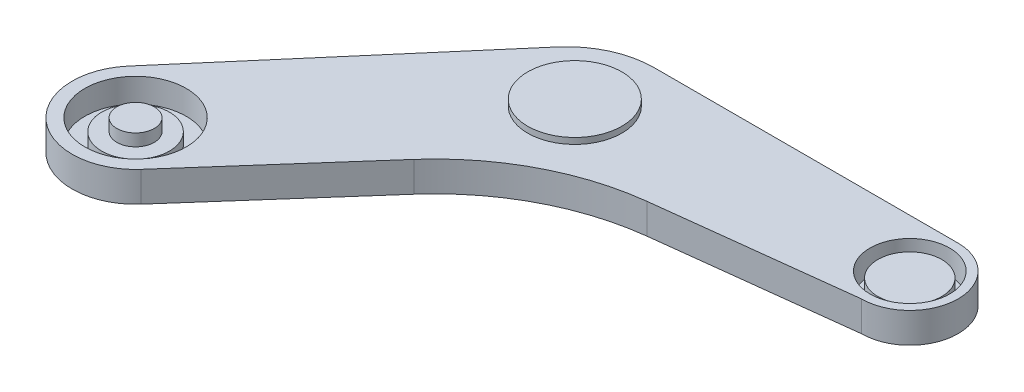
ISO-10303-21;
HEADER;
FILE_DESCRIPTION(('STEP AP214'),'2;1');
FILE_NAME('part.step','',(''),(''),'','','');
FILE_SCHEMA(('AUTOMOTIVE_DESIGN { 1 0 10303 214 1 1 1 1 }'));
ENDSEC;
DATA;
#1=APPLICATION_CONTEXT('core data for automotive mechanical design processes');
#2=APPLICATION_PROTOCOL_DEFINITION('international standard','automotive_design',2000,#1);
#3=PRODUCT_CONTEXT('',#1,'mechanical');
#4=PRODUCT('Part','Part','',(#3));
#5=PRODUCT_RELATED_PRODUCT_CATEGORY('part','',(#4));
#6=PRODUCT_DEFINITION_FORMATION('','',#4);
#7=PRODUCT_DEFINITION_CONTEXT('part definition',#1,'design');
#8=PRODUCT_DEFINITION('design','',#6,#7);
#9=PRODUCT_DEFINITION_SHAPE('','',#8);
#10=(LENGTH_UNIT() NAMED_UNIT(*) SI_UNIT(.MILLI.,.METRE.));
#11=(NAMED_UNIT(*) PLANE_ANGLE_UNIT() SI_UNIT($,.RADIAN.));
#12=(NAMED_UNIT(*) SI_UNIT($,.STERADIAN.) SOLID_ANGLE_UNIT());
#13=UNCERTAINTY_MEASURE_WITH_UNIT(LENGTH_MEASURE(1.E-05),#10,'distance_accuracy_value','');
#14=(GEOMETRIC_REPRESENTATION_CONTEXT(3) GLOBAL_UNCERTAINTY_ASSIGNED_CONTEXT((#13)) GLOBAL_UNIT_ASSIGNED_CONTEXT((#10,
#11,#12)) REPRESENTATION_CONTEXT('',''));
#15=CARTESIAN_POINT('',(0.,0.,0.));
#16=DIRECTION('',(0.,0.,1.));
#17=DIRECTION('',(1.,0.,0.));
#18=AXIS2_PLACEMENT_3D('',#15,#16,#17);
#19=CARTESIAN_POINT('',(243.447275793049,50.,474.15822190538));
#20=DIRECTION('',(0.,-1.,0.));
#21=DIRECTION('',(0.,0.,-1.));
#22=AXIS2_PLACEMENT_3D('',#19,#20,#21);
#23=CYLINDRICAL_SURFACE('',#22,400.);
#24=CARTESIAN_POINT('',(243.447275793049,0.,474.15822190538));
#25=DIRECTION('',(0.,1.,0.));
#26=DIRECTION('',(0.,0.,1.));
#27=AXIS2_PLACEMENT_3D('',#24,#25,#26);
#28=CIRCLE('',#27,400.);
#29=CARTESIAN_POINT('',(196.291302455074,0.,76.9475546536709));
#30=VERTEX_POINT('',#29);
#31=CARTESIAN_POINT('',(-56.6839412683943,0.,209.731951377626));
#32=VERTEX_POINT('',#31);
#33=EDGE_CURVE('E133',#30,#32,#28,.T.);
#34=ORIENTED_EDGE('',*,*,#33,.F.);
#35=DIRECTION('',(0.,-1.,0.));
#36=VECTOR('',#35,1.);
#37=CARTESIAN_POINT('',(196.291302455074,50.,76.9475546536709));
#38=LINE('',#37,#36);
#39=CARTESIAN_POINT('',(196.291302455074,50.,76.9475546536709));
#40=VERTEX_POINT('',#39);
#41=EDGE_CURVE('E39',#40,#30,#38,.T.);
#42=ORIENTED_EDGE('',*,*,#41,.F.);
#43=CARTESIAN_POINT('',(243.447275793049,50.,474.15822190538));
#44=DIRECTION('',(0.,1.,0.));
#45=DIRECTION('',(0.,0.,1.));
#46=AXIS2_PLACEMENT_3D('',#43,#44,#45);
#47=CIRCLE('',#46,400.);
#48=CARTESIAN_POINT('',(-56.6839412683943,50.,209.731951377626));
#49=VERTEX_POINT('',#48);
#50=EDGE_CURVE('E153',#40,#49,#47,.T.);
#51=ORIENTED_EDGE('',*,*,#50,.T.);
#52=DIRECTION('',(0.,-1.,0.));
#53=VECTOR('',#52,1.);
#54=CARTESIAN_POINT('',(-56.6839412683943,50.,209.731951377626));
#55=LINE('',#54,#53);
#56=EDGE_CURVE('E89',#49,#32,#55,.T.);
#57=ORIENTED_EDGE('',*,*,#56,.T.);
#58=EDGE_LOOP('',(#34,#42,#51,#57));
#59=FACE_BOUND('',#58,.T.);
#60=ADVANCED_FACE('F36',(#59),#23,.F.);
#61=CARTESIAN_POINT('',(11.7361482736743,50.,98.8575350431175));
#62=DIRECTION('',(0.117889933344937,0.,0.993026668129273));
#63=DIRECTION('',(0.993026668129274,0.,-0.117889933344937));
#64=AXIS2_PLACEMENT_3D('',#61,#62,#63);
#65=PLANE('',#64);
#66=DIRECTION('',(-0.993026668129274,0.,0.117889933344937));
#67=VECTOR('',#66,1.);
#68=CARTESIAN_POINT('',(11.7361482736743,0.,98.8575350431175));
#69=LINE('',#68,#67);
#70=CARTESIAN_POINT('',(514.059836256441,0.,39.222775983291));
#71=VERTEX_POINT('',#70);
#72=EDGE_CURVE('E136',#71,#30,#69,.T.);
#73=ORIENTED_EDGE('',*,*,#72,.F.);
#74=DIRECTION('',(0.,-1.,0.));
#75=VECTOR('',#74,1.);
#76=CARTESIAN_POINT('',(514.059836256441,50.,39.222775983291));
#77=LINE('',#76,#75);
#78=CARTESIAN_POINT('',(514.059836256441,50.,39.222775983291));
#79=VERTEX_POINT('',#78);
#80=EDGE_CURVE('E160',#79,#71,#77,.T.);
#81=ORIENTED_EDGE('',*,*,#80,.F.);
#82=DIRECTION('',(-0.993026668129274,0.,0.117889933344937));
#83=VECTOR('',#82,1.);
#84=CARTESIAN_POINT('',(11.7361482736743,50.,98.8575350431175));
#85=LINE('',#84,#83);
#86=EDGE_CURVE('E193',#79,#40,#85,.T.);
#87=ORIENTED_EDGE('',*,*,#86,.T.);
#88=ORIENTED_EDGE('',*,*,#41,.T.);
#89=EDGE_LOOP('',(#73,#81,#87,#88));
#90=FACE_BOUND('',#89,.T.);
#91=ADVANCED_FACE('F210',(#90),#65,.T.);
#92=CARTESIAN_POINT('',(514.059836256441,50.,-40.777224016709));
#93=DIRECTION('',(0.,-1.,0.));
#94=DIRECTION('',(0.,0.,-1.));
#95=AXIS2_PLACEMENT_3D('',#92,#93,#94);
#96=CYLINDRICAL_SURFACE('',#95,80.);
#97=CARTESIAN_POINT('',(514.059836256441,0.,-40.777224016709));
#98=DIRECTION('',(0.,1.,0.));
#99=DIRECTION('',(0.,0.,1.));
#100=AXIS2_PLACEMENT_3D('',#97,#98,#99);
#101=CIRCLE('',#100,80.);
#102=CARTESIAN_POINT('',(514.059836256441,0.,-120.777224016709));
#103=VERTEX_POINT('',#102);
#104=EDGE_CURVE('E140',#71,#103,#101,.T.);
#105=ORIENTED_EDGE('',*,*,#104,.T.);
#106=DIRECTION('',(0.,-1.,0.));
#107=VECTOR('',#106,1.);
#108=CARTESIAN_POINT('',(514.059836256441,50.,-120.777224016709));
#109=LINE('',#108,#107);
#110=CARTESIAN_POINT('',(514.059836256441,50.,-120.777224016709));
#111=VERTEX_POINT('',#110);
#112=EDGE_CURVE('E159',#111,#103,#109,.T.);
#113=ORIENTED_EDGE('',*,*,#112,.F.);
#114=CARTESIAN_POINT('',(514.059836256441,50.,-40.777224016709));
#115=DIRECTION('',(0.,1.,0.));
#116=DIRECTION('',(0.,0.,1.));
#117=AXIS2_PLACEMENT_3D('',#114,#115,#116);
#118=CIRCLE('',#117,80.);
#119=EDGE_CURVE('E195',#79,#111,#118,.T.);
#120=ORIENTED_EDGE('',*,*,#119,.F.);
#121=ORIENTED_EDGE('',*,*,#80,.T.);
#122=EDGE_LOOP('',(#105,#113,#120,#121));
#123=FACE_BOUND('',#122,.T.);
#124=ADVANCED_FACE('F211',(#123),#96,.T.);
#125=CARTESIAN_POINT('',(0.,50.,-120.777224016709));
#126=DIRECTION('',(0.,0.,-1.));
#127=DIRECTION('',(-1.,0.,0.));
#128=AXIS2_PLACEMENT_3D('',#125,#126,#127);
#129=PLANE('',#128);
#130=DIRECTION('',(1.,0.,0.));
#131=VECTOR('',#130,1.);
#132=CARTESIAN_POINT('',(0.,0.,-120.777224016709));
#133=LINE('',#132,#131);
#134=CARTESIAN_POINT('',(10.7784276607523,0.,-120.777224016709));
#135=VERTEX_POINT('',#134);
#136=EDGE_CURVE('E143',#135,#103,#133,.T.);
#137=ORIENTED_EDGE('',*,*,#136,.F.);
#138=DIRECTION('',(0.,-1.,0.));
#139=VECTOR('',#138,1.);
#140=CARTESIAN_POINT('',(10.7784276607523,50.,-120.777224016709));
#141=LINE('',#140,#139);
#142=CARTESIAN_POINT('',(10.7784276607523,50.,-120.777224016709));
#143=VERTEX_POINT('',#142);
#144=EDGE_CURVE('E157',#143,#135,#141,.T.);
#145=ORIENTED_EDGE('',*,*,#144,.F.);
#146=DIRECTION('',(1.,0.,0.));
#147=VECTOR('',#146,1.);
#148=CARTESIAN_POINT('',(0.,50.,-120.777224016709));
#149=LINE('',#148,#147);
#150=EDGE_CURVE('E128',#143,#111,#149,.T.);
#151=ORIENTED_EDGE('',*,*,#150,.T.);
#152=ORIENTED_EDGE('',*,*,#112,.T.);
#153=EDGE_LOOP('',(#137,#145,#151,#152));
#154=FACE_BOUND('',#153,.T.);
#155=ADVANCED_FACE('F199',(#154),#129,.T.);
#156=CARTESIAN_POINT('',(10.7784276607523,50.,24.2227759832912));
#157=DIRECTION('',(0.,-1.,0.));
#158=DIRECTION('',(0.,0.,-1.));
#159=AXIS2_PLACEMENT_3D('',#156,#157,#158);
#160=CYLINDRICAL_SURFACE('',#159,145.);
#161=CARTESIAN_POINT('',(10.7784276607523,0.,24.2227759832912));
#162=DIRECTION('',(0.,1.,0.));
#163=DIRECTION('',(0.,0.,1.));
#164=AXIS2_PLACEMENT_3D('',#161,#162,#163);
#165=CIRCLE('',#164,145.);
#166=CARTESIAN_POINT('',(-99.3438825510357,0.,-70.1068418131291));
#167=VERTEX_POINT('',#166);
#168=EDGE_CURVE('E146',#167,#135,#165,.F.);
#169=ORIENTED_EDGE('',*,*,#168,.F.);
#170=DIRECTION('',(0.,-1.,0.));
#171=VECTOR('',#170,1.);
#172=CARTESIAN_POINT('',(-99.3438825510357,50.,-70.1068418131291));
#173=LINE('',#172,#171);
#174=CARTESIAN_POINT('',(-99.3438825510357,50.,-70.1068418131291));
#175=VERTEX_POINT('',#174);
#176=EDGE_CURVE('E116',#175,#167,#173,.T.);
#177=ORIENTED_EDGE('',*,*,#176,.F.);
#178=CARTESIAN_POINT('',(10.7784276607523,50.,24.2227759832912));
#179=DIRECTION('',(0.,1.,0.));
#180=DIRECTION('',(0.,0.,1.));
#181=AXIS2_PLACEMENT_3D('',#178,#179,#180);
#182=CIRCLE('',#181,145.);
#183=EDGE_CURVE('E126',#175,#143,#182,.F.);
#184=ORIENTED_EDGE('',*,*,#183,.T.);
#185=ORIENTED_EDGE('',*,*,#144,.T.);
#186=EDGE_LOOP('',(#169,#177,#184,#185));
#187=FACE_BOUND('',#186,.T.);
#188=ADVANCED_FACE('F204',(#187),#160,.T.);
#189=CARTESIAN_POINT('',(-91.937748677205,50.,-78.752912803093));
#190=DIRECTION('',(-0.759464208357158,0.,-0.650549088251175));
#191=DIRECTION('',(-0.650549088251175,0.,0.759464208357158));
#192=AXIS2_PLACEMENT_3D('',#189,#190,#191);
#193=PLANE('',#192);
#194=DIRECTION('',(0.650549088251175,0.,-0.759464208357159));
#195=VECTOR('',#194,1.);
#196=CARTESIAN_POINT('',(-91.937748677205,0.,-78.752912803093));
#197=LINE('',#196,#195);
#198=CARTESIAN_POINT('',(-426.753144046728,0.,312.117374746871));
#199=VERTEX_POINT('',#198);
#200=EDGE_CURVE('E115',#199,#167,#197,.T.);
#201=ORIENTED_EDGE('',*,*,#200,.F.);
#202=DIRECTION('',(0.,-1.,0.));
#203=VECTOR('',#202,1.);
#204=CARTESIAN_POINT('',(-426.753144046728,50.,312.117374746871));
#205=LINE('',#204,#203);
#206=CARTESIAN_POINT('',(-426.753144046728,50.,312.117374746871));
#207=VERTEX_POINT('',#206);
#208=EDGE_CURVE('E109',#207,#199,#205,.T.);
#209=ORIENTED_EDGE('',*,*,#208,.F.);
#210=DIRECTION('',(0.650549088251175,0.,-0.759464208357159));
#211=VECTOR('',#210,1.);
#212=CARTESIAN_POINT('',(-91.937748677205,50.,-78.752912803093));
#213=LINE('',#212,#211);
#214=EDGE_CURVE('E113',#207,#175,#213,.T.);
#215=ORIENTED_EDGE('',*,*,#214,.T.);
#216=ORIENTED_EDGE('',*,*,#176,.T.);
#217=EDGE_LOOP('',(#201,#209,#215,#216));
#218=FACE_BOUND('',#217,.T.);
#219=ADVANCED_FACE('F111',(#218),#193,.T.);
#220=CARTESIAN_POINT('',(-347.009402169226,50.,380.425029013245));
#221=DIRECTION('',(0.,-1.,0.));
#222=DIRECTION('',(0.,0.,-1.));
#223=AXIS2_PLACEMENT_3D('',#220,#221,#222);
#224=CYLINDRICAL_SURFACE('',#223,105.);
#225=CARTESIAN_POINT('',(-347.009402169226,0.,380.425029013245));
#226=DIRECTION('',(0.,1.,0.));
#227=DIRECTION('',(0.,0.,1.));
#228=AXIS2_PLACEMENT_3D('',#225,#226,#227);
#229=CIRCLE('',#228,105.);
#230=CARTESIAN_POINT('',(-268.224957690598,0.,449.83692502678));
#231=VERTEX_POINT('',#230);
#232=EDGE_CURVE('E82',#199,#231,#229,.T.);
#233=ORIENTED_EDGE('',*,*,#232,.T.);
#234=DIRECTION('',(0.,-1.,0.));
#235=VECTOR('',#234,1.);
#236=CARTESIAN_POINT('',(-268.224957690598,50.,449.83692502678));
#237=LINE('',#236,#235);
#238=CARTESIAN_POINT('',(-268.224957690598,50.,449.83692502678));
#239=VERTEX_POINT('',#238);
#240=EDGE_CURVE('E117',#239,#231,#237,.T.);
#241=ORIENTED_EDGE('',*,*,#240,.F.);
#242=CARTESIAN_POINT('',(-347.009402169226,50.,380.425029013245));
#243=DIRECTION('',(0.,1.,0.));
#244=DIRECTION('',(0.,0.,1.));
#245=AXIS2_PLACEMENT_3D('',#242,#243,#244);
#246=CIRCLE('',#245,105.);
#247=EDGE_CURVE('E119',#207,#239,#246,.T.);
#248=ORIENTED_EDGE('',*,*,#247,.F.);
#249=ORIENTED_EDGE('',*,*,#208,.T.);
#250=EDGE_LOOP('',(#233,#241,#248,#249));
#251=FACE_BOUND('',#250,.T.);
#252=ADVANCED_FACE('F120',(#251),#224,.T.);
#253=CARTESIAN_POINT('',(72.1178125200194,50.,63.5383562896243));
#254=DIRECTION('',(-0.750328042653607,0.,-0.661065676319386));
#255=DIRECTION('',(-0.661065676319386,0.,0.750328042653607));
#256=AXIS2_PLACEMENT_3D('',#253,#254,#255);
#257=PLANE('',#256);
#258=DIRECTION('',(0.661065676319386,0.,-0.750328042653607));
#259=VECTOR('',#258,1.);
#260=CARTESIAN_POINT('',(72.1178125200194,0.,63.5383562896243));
#261=LINE('',#260,#259);
#262=EDGE_CURVE('E151',#231,#32,#261,.T.);
#263=ORIENTED_EDGE('',*,*,#262,.T.);
#264=ORIENTED_EDGE('',*,*,#56,.F.);
#265=DIRECTION('',(0.661065676319386,0.,-0.750328042653607));
#266=VECTOR('',#265,1.);
#267=CARTESIAN_POINT('',(72.1178125200194,50.,63.5383562896243));
#268=LINE('',#267,#266);
#269=EDGE_CURVE('E54',#239,#49,#268,.T.);
#270=ORIENTED_EDGE('',*,*,#269,.F.);
#271=ORIENTED_EDGE('',*,*,#240,.T.);
#272=EDGE_LOOP('',(#263,#264,#270,#271));
#273=FACE_BOUND('',#272,.T.);
#274=ADVANCED_FACE('F209',(#273),#257,.F.);
#275=CARTESIAN_POINT('',(0.,50.,0.));
#276=DIRECTION('',(0.,1.,0.));
#277=DIRECTION('',(0.,0.,1.));
#278=AXIS2_PLACEMENT_3D('',#275,#276,#277);
#279=PLANE('',#278);
#280=CARTESIAN_POINT('',(0.,50.,0.));
#281=DIRECTION('',(0.,1.,0.));
#282=DIRECTION('',(0.,0.,1.));
#283=AXIS2_PLACEMENT_3D('',#280,#281,#282);
#284=CIRCLE('',#283,77.9949043939151);
#285=CARTESIAN_POINT('',(0.,50.,77.9949043939151));
#286=VERTEX_POINT('',#285);
#287=EDGE_CURVE('E455',#286,#286,#284,.T.);
#288=ORIENTED_EDGE('',*,*,#287,.F.);
#289=EDGE_LOOP('',(#288));
#290=FACE_BOUND('',#289,.T.);
#291=CARTESIAN_POINT('',(514.059836256441,50.,-40.777224016709));
#292=DIRECTION('',(0.,1.,0.));
#293=DIRECTION('',(0.,0.,1.));
#294=AXIS2_PLACEMENT_3D('',#291,#292,#293);
#295=CIRCLE('',#294,66.);
#296=CARTESIAN_POINT('',(514.059836256441,50.,25.222775983291));
#297=VERTEX_POINT('',#296);
#298=EDGE_CURVE('E178',#297,#297,#295,.T.);
#299=ORIENTED_EDGE('',*,*,#298,.F.);
#300=EDGE_LOOP('',(#299));
#301=FACE_BOUND('',#300,.T.);
#302=CARTESIAN_POINT('',(-347.009402169226,50.,380.425029013245));
#303=DIRECTION('',(0.,1.,0.));
#304=DIRECTION('',(0.,0.,1.));
#305=AXIS2_PLACEMENT_3D('',#302,#303,#304);
#306=CIRCLE('',#305,84.);
#307=CARTESIAN_POINT('',(-347.009402169226,50.,464.425029013245));
#308=VERTEX_POINT('',#307);
#309=EDGE_CURVE('E185',#308,#308,#306,.T.);
#310=ORIENTED_EDGE('',*,*,#309,.F.);
#311=EDGE_LOOP('',(#310));
#312=FACE_BOUND('',#311,.T.);
#313=ORIENTED_EDGE('',*,*,#50,.F.);
#314=ORIENTED_EDGE('',*,*,#86,.F.);
#315=ORIENTED_EDGE('',*,*,#119,.T.);
#316=ORIENTED_EDGE('',*,*,#150,.F.);
#317=ORIENTED_EDGE('',*,*,#183,.F.);
#318=ORIENTED_EDGE('',*,*,#214,.F.);
#319=ORIENTED_EDGE('',*,*,#247,.T.);
#320=ORIENTED_EDGE('',*,*,#269,.T.);
#321=EDGE_LOOP('',(#313,#314,#315,#316,#317,#318,#319,#320));
#322=FACE_BOUND('',#321,.T.);
#323=ADVANCED_FACE('F123',(#290,#301,#312,#322),#279,.T.);
#324=CARTESIAN_POINT('',(0.,0.,0.));
#325=DIRECTION('',(0.,1.,0.));
#326=DIRECTION('',(0.,0.,1.));
#327=AXIS2_PLACEMENT_3D('',#324,#325,#326);
#328=PLANE('',#327);
#329=CARTESIAN_POINT('',(0.,0.,0.));
#330=DIRECTION('',(0.,-1.,0.));
#331=DIRECTION('',(0.,0.,-1.));
#332=AXIS2_PLACEMENT_3D('',#329,#330,#331);
#333=CIRCLE('',#332,81.1187900552058);
#334=CARTESIAN_POINT('',(0.,0.,-81.1187900552058));
#335=VERTEX_POINT('',#334);
#336=EDGE_CURVE('E11',#335,#335,#333,.T.);
#337=ORIENTED_EDGE('',*,*,#336,.F.);
#338=EDGE_LOOP('',(#337));
#339=FACE_BOUND('',#338,.T.);
#340=ORIENTED_EDGE('',*,*,#33,.T.);
#341=ORIENTED_EDGE('',*,*,#262,.F.);
#342=ORIENTED_EDGE('',*,*,#232,.F.);
#343=ORIENTED_EDGE('',*,*,#200,.T.);
#344=ORIENTED_EDGE('',*,*,#168,.T.);
#345=ORIENTED_EDGE('',*,*,#136,.T.);
#346=ORIENTED_EDGE('',*,*,#104,.F.);
#347=ORIENTED_EDGE('',*,*,#72,.T.);
#348=EDGE_LOOP('',(#340,#341,#342,#343,#344,#345,#346,#347));
#349=FACE_BOUND('',#348,.T.);
#350=ADVANCED_FACE('F206',(#339,#349),#328,.F.);
#351=CARTESIAN_POINT('',(-347.009402169226,10.,380.425029013245));
#352=DIRECTION('',(0.,1.,0.));
#353=DIRECTION('',(0.,0.,1.));
#354=AXIS2_PLACEMENT_3D('',#351,#352,#353);
#355=CYLINDRICAL_SURFACE('',#354,84.);
#356=CARTESIAN_POINT('',(-347.009402169226,10.,380.425029013245));
#357=DIRECTION('',(0.,1.,0.));
#358=DIRECTION('',(0.,0.,1.));
#359=AXIS2_PLACEMENT_3D('',#356,#357,#358);
#360=CIRCLE('',#359,84.);
#361=CARTESIAN_POINT('',(-347.009402169226,10.,464.425029013245));
#362=VERTEX_POINT('',#361);
#363=EDGE_CURVE('E137',#362,#362,#360,.T.);
#364=ORIENTED_EDGE('',*,*,#363,.F.);
#365=EDGE_LOOP('',(#364));
#366=FACE_BOUND('',#365,.T.);
#367=ORIENTED_EDGE('',*,*,#309,.T.);
#368=EDGE_LOOP('',(#367));
#369=FACE_BOUND('',#368,.T.);
#370=ADVANCED_FACE('F275',(#366,#369),#355,.F.);
#371=CARTESIAN_POINT('',(-347.009402169226,10.,380.425029013245));
#372=DIRECTION('',(0.,1.,0.));
#373=DIRECTION('',(0.,0.,1.));
#374=AXIS2_PLACEMENT_3D('',#371,#372,#373);
#375=PLANE('',#374);
#376=CARTESIAN_POINT('',(-347.009402169226,10.,380.425029013245));
#377=DIRECTION('',(0.,1.,0.));
#378=DIRECTION('',(0.,0.,1.));
#379=AXIS2_PLACEMENT_3D('',#376,#377,#378);
#380=CIRCLE('',#379,56.);
#381=CARTESIAN_POINT('',(-347.009402169226,10.,436.425029013245));
#382=VERTEX_POINT('',#381);
#383=EDGE_CURVE('E179',#382,#382,#380,.T.);
#384=ORIENTED_EDGE('',*,*,#383,.F.);
#385=EDGE_LOOP('',(#384));
#386=FACE_BOUND('',#385,.T.);
#387=ORIENTED_EDGE('',*,*,#363,.T.);
#388=EDGE_LOOP('',(#387));
#389=FACE_BOUND('',#388,.T.);
#390=ADVANCED_FACE('F280',(#386,#389),#375,.T.);
#391=CARTESIAN_POINT('',(514.059836256441,10.,-40.777224016709));
#392=DIRECTION('',(0.,1.,0.));
#393=DIRECTION('',(0.,0.,1.));
#394=AXIS2_PLACEMENT_3D('',#391,#392,#393);
#395=CYLINDRICAL_SURFACE('',#394,66.);
#396=CARTESIAN_POINT('',(514.059836256441,10.,-40.777224016709));
#397=DIRECTION('',(0.,1.,0.));
#398=DIRECTION('',(0.,0.,1.));
#399=AXIS2_PLACEMENT_3D('',#396,#397,#398);
#400=CIRCLE('',#399,66.);
#401=CARTESIAN_POINT('',(514.059836256441,10.,25.222775983291));
#402=VERTEX_POINT('',#401);
#403=EDGE_CURVE('E182',#402,#402,#400,.T.);
#404=ORIENTED_EDGE('',*,*,#403,.F.);
#405=EDGE_LOOP('',(#404));
#406=FACE_BOUND('',#405,.T.);
#407=ORIENTED_EDGE('',*,*,#298,.T.);
#408=EDGE_LOOP('',(#407));
#409=FACE_BOUND('',#408,.T.);
#410=ADVANCED_FACE('F290',(#406,#409),#395,.F.);
#411=CARTESIAN_POINT('',(514.059836256441,10.,-40.777224016709));
#412=DIRECTION('',(0.,1.,0.));
#413=DIRECTION('',(0.,0.,1.));
#414=AXIS2_PLACEMENT_3D('',#411,#412,#413);
#415=PLANE('',#414);
#416=CARTESIAN_POINT('',(514.059836256441,10.,-40.777224016709));
#417=DIRECTION('',(0.,1.,0.));
#418=DIRECTION('',(0.,0.,1.));
#419=AXIS2_PLACEMENT_3D('',#416,#417,#418);
#420=CIRCLE('',#419,53.);
#421=CARTESIAN_POINT('',(514.059836256441,10.,12.222775983291));
#422=VERTEX_POINT('',#421);
#423=EDGE_CURVE('E458',#422,#422,#420,.T.);
#424=ORIENTED_EDGE('',*,*,#423,.F.);
#425=EDGE_LOOP('',(#424));
#426=FACE_BOUND('',#425,.T.);
#427=ORIENTED_EDGE('',*,*,#403,.T.);
#428=EDGE_LOOP('',(#427));
#429=FACE_BOUND('',#428,.T.);
#430=ADVANCED_FACE('F295',(#426,#429),#415,.T.);
#431=CARTESIAN_POINT('',(-347.009402169226,30.,380.425029013245));
#432=DIRECTION('',(0.,-1.,0.));
#433=DIRECTION('',(0.,0.,-1.));
#434=AXIS2_PLACEMENT_3D('',#431,#432,#433);
#435=CYLINDRICAL_SURFACE('',#434,56.);
#436=CARTESIAN_POINT('',(-347.009402169226,30.,380.425029013245));
#437=DIRECTION('',(0.,1.,0.));
#438=DIRECTION('',(0.,0.,1.));
#439=AXIS2_PLACEMENT_3D('',#436,#437,#438);
#440=CIRCLE('',#439,56.);
#441=CARTESIAN_POINT('',(-347.009402169226,30.,436.425029013245));
#442=VERTEX_POINT('',#441);
#443=EDGE_CURVE('E175',#442,#442,#440,.T.);
#444=ORIENTED_EDGE('',*,*,#443,.F.);
#445=EDGE_LOOP('',(#444));
#446=FACE_BOUND('',#445,.T.);
#447=ORIENTED_EDGE('',*,*,#383,.T.);
#448=EDGE_LOOP('',(#447));
#449=FACE_BOUND('',#448,.T.);
#450=ADVANCED_FACE('F310',(#446,#449),#435,.T.);
#451=CARTESIAN_POINT('',(-347.009402169226,30.,380.425029013245));
#452=DIRECTION('',(0.,1.,0.));
#453=DIRECTION('',(0.,0.,1.));
#454=AXIS2_PLACEMENT_3D('',#451,#452,#453);
#455=PLANE('',#454);
#456=CARTESIAN_POINT('',(-347.009402169226,30.,380.425029013245));
#457=DIRECTION('',(0.,1.,0.));
#458=DIRECTION('',(0.,0.,1.));
#459=AXIS2_PLACEMENT_3D('',#456,#457,#458);
#460=CIRCLE('',#459,31.);
#461=CARTESIAN_POINT('',(-347.009402169226,30.,411.425029013245));
#462=VERTEX_POINT('',#461);
#463=EDGE_CURVE('E45',#462,#462,#460,.T.);
#464=ORIENTED_EDGE('',*,*,#463,.F.);
#465=EDGE_LOOP('',(#464));
#466=FACE_BOUND('',#465,.T.);
#467=ORIENTED_EDGE('',*,*,#443,.T.);
#468=EDGE_LOOP('',(#467));
#469=FACE_BOUND('',#468,.T.);
#470=ADVANCED_FACE('F315',(#466,#469),#455,.T.);
#471=CARTESIAN_POINT('',(-347.009402169226,50.,380.425029013245));
#472=DIRECTION('',(0.,-1.,0.));
#473=DIRECTION('',(0.,0.,-1.));
#474=AXIS2_PLACEMENT_3D('',#471,#472,#473);
#475=CYLINDRICAL_SURFACE('',#474,31.);
#476=CARTESIAN_POINT('',(-347.009402169226,50.,380.425029013245));
#477=DIRECTION('',(0.,1.,0.));
#478=DIRECTION('',(0.,0.,1.));
#479=AXIS2_PLACEMENT_3D('',#476,#477,#478);
#480=CIRCLE('',#479,31.);
#481=CARTESIAN_POINT('',(-347.009402169226,50.,411.425029013245));
#482=VERTEX_POINT('',#481);
#483=EDGE_CURVE('E173',#482,#482,#480,.T.);
#484=ORIENTED_EDGE('',*,*,#483,.F.);
#485=EDGE_LOOP('',(#484));
#486=FACE_BOUND('',#485,.T.);
#487=ORIENTED_EDGE('',*,*,#463,.T.);
#488=EDGE_LOOP('',(#487));
#489=FACE_BOUND('',#488,.T.);
#490=ADVANCED_FACE('F326',(#486,#489),#475,.T.);
#491=CARTESIAN_POINT('',(-347.009402169226,50.,380.425029013245));
#492=DIRECTION('',(0.,1.,0.));
#493=DIRECTION('',(0.,0.,1.));
#494=AXIS2_PLACEMENT_3D('',#491,#492,#493);
#495=PLANE('',#494);
#496=ORIENTED_EDGE('',*,*,#483,.T.);
#497=EDGE_LOOP('',(#496));
#498=FACE_BOUND('',#497,.T.);
#499=ADVANCED_FACE('F338',(#498),#495,.T.);
#500=CARTESIAN_POINT('',(514.059836256441,40.,-40.777224016709));
#501=DIRECTION('',(0.,-1.,0.));
#502=DIRECTION('',(0.,0.,-1.));
#503=AXIS2_PLACEMENT_3D('',#500,#501,#502);
#504=CYLINDRICAL_SURFACE('',#503,53.);
#505=CARTESIAN_POINT('',(514.059836256441,40.,-40.777224016709));
#506=DIRECTION('',(0.,1.,0.));
#507=DIRECTION('',(0.,0.,1.));
#508=AXIS2_PLACEMENT_3D('',#505,#506,#507);
#509=CIRCLE('',#508,53.);
#510=CARTESIAN_POINT('',(514.059836256441,40.,12.222775983291));
#511=VERTEX_POINT('',#510);
#512=EDGE_CURVE('E463',#511,#511,#509,.T.);
#513=ORIENTED_EDGE('',*,*,#512,.F.);
#514=EDGE_LOOP('',(#513));
#515=FACE_BOUND('',#514,.T.);
#516=ORIENTED_EDGE('',*,*,#423,.T.);
#517=EDGE_LOOP('',(#516));
#518=FACE_BOUND('',#517,.T.);
#519=ADVANCED_FACE('F349',(#515,#518),#504,.T.);
#520=CARTESIAN_POINT('',(514.059836256441,40.,-40.777224016709));
#521=DIRECTION('',(0.,1.,0.));
#522=DIRECTION('',(0.,0.,1.));
#523=AXIS2_PLACEMENT_3D('',#520,#521,#522);
#524=PLANE('',#523);
#525=ORIENTED_EDGE('',*,*,#512,.T.);
#526=EDGE_LOOP('',(#525));
#527=FACE_BOUND('',#526,.T.);
#528=ADVANCED_FACE('F367',(#527),#524,.T.);
#529=CARTESIAN_POINT('',(0.,-10.,0.));
#530=DIRECTION('',(0.,1.,0.));
#531=DIRECTION('',(0.,0.,1.));
#532=AXIS2_PLACEMENT_3D('',#529,#530,#531);
#533=CYLINDRICAL_SURFACE('',#532,81.1187900552058);
#534=CARTESIAN_POINT('',(0.,-10.,0.));
#535=DIRECTION('',(0.,-1.,0.));
#536=DIRECTION('',(0.,0.,-1.));
#537=AXIS2_PLACEMENT_3D('',#534,#535,#536);
#538=CIRCLE('',#537,81.1187900552058);
#539=CARTESIAN_POINT('',(0.,-10.,-81.1187900552058));
#540=VERTEX_POINT('',#539);
#541=EDGE_CURVE('E454',#540,#540,#538,.T.);
#542=ORIENTED_EDGE('',*,*,#541,.F.);
#543=EDGE_LOOP('',(#542));
#544=FACE_BOUND('',#543,.T.);
#545=ORIENTED_EDGE('',*,*,#336,.T.);
#546=EDGE_LOOP('',(#545));
#547=FACE_BOUND('',#546,.T.);
#548=ADVANCED_FACE('F377',(#544,#547),#533,.T.);
#549=CARTESIAN_POINT('',(0.,-10.,0.));
#550=DIRECTION('',(0.,-1.,0.));
#551=DIRECTION('',(0.,0.,-1.));
#552=AXIS2_PLACEMENT_3D('',#549,#550,#551);
#553=PLANE('',#552);
#554=ORIENTED_EDGE('',*,*,#541,.T.);
#555=EDGE_LOOP('',(#554));
#556=FACE_BOUND('',#555,.T.);
#557=ADVANCED_FACE('F396',(#556),#553,.T.);
#558=CARTESIAN_POINT('',(0.,60.,0.));
#559=DIRECTION('',(0.,-1.,0.));
#560=DIRECTION('',(0.,0.,-1.));
#561=AXIS2_PLACEMENT_3D('',#558,#559,#560);
#562=CYLINDRICAL_SURFACE('',#561,77.9949043939151);
#563=CARTESIAN_POINT('',(0.,60.,0.));
#564=DIRECTION('',(0.,1.,0.));
#565=DIRECTION('',(0.,0.,1.));
#566=AXIS2_PLACEMENT_3D('',#563,#564,#565);
#567=CIRCLE('',#566,77.9949043939151);
#568=CARTESIAN_POINT('',(0.,60.,77.9949043939151));
#569=VERTEX_POINT('',#568);
#570=EDGE_CURVE('E453',#569,#569,#567,.T.);
#571=ORIENTED_EDGE('',*,*,#570,.F.);
#572=EDGE_LOOP('',(#571));
#573=FACE_BOUND('',#572,.T.);
#574=ORIENTED_EDGE('',*,*,#287,.T.);
#575=EDGE_LOOP('',(#574));
#576=FACE_BOUND('',#575,.T.);
#577=ADVANCED_FACE('F406',(#573,#576),#562,.T.);
#578=CARTESIAN_POINT('',(0.,60.,0.));
#579=DIRECTION('',(0.,1.,0.));
#580=DIRECTION('',(0.,0.,1.));
#581=AXIS2_PLACEMENT_3D('',#578,#579,#580);
#582=PLANE('',#581);
#583=ORIENTED_EDGE('',*,*,#570,.T.);
#584=EDGE_LOOP('',(#583));
#585=FACE_BOUND('',#584,.T.);
#586=ADVANCED_FACE('F424',(#585),#582,.T.);
#587=CLOSED_SHELL('',(#60,#91,#124,#155,#188,#219,#252,#274,#323,#350,#370,#390,#410,#430,#450,
#470,#490,#499,#519,#528,#548,#557,#577,#586));
#588=MANIFOLD_SOLID_BREP('B2',#587);
#589=ADVANCED_BREP_SHAPE_REPRESENTATION('',(#18,#588),#14);
#590=SHAPE_DEFINITION_REPRESENTATION(#9,#589);
ENDSEC;
END-ISO-10303-21;
